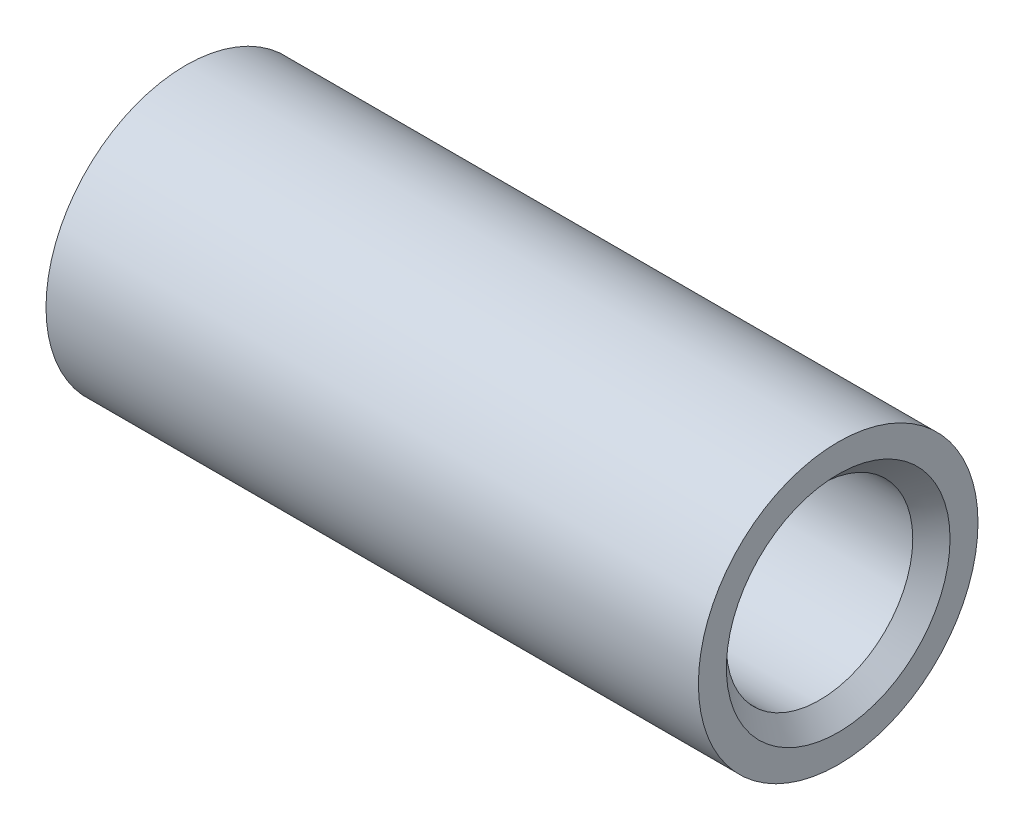
ISO-10303-21;
HEADER;
FILE_DESCRIPTION(('STEP AP214'),'2;1');
FILE_NAME('part.step','',(''),(''),'','','');
FILE_SCHEMA(('AUTOMOTIVE_DESIGN { 1 0 10303 214 1 1 1 1 }'));
ENDSEC;
DATA;
#1=APPLICATION_CONTEXT('core data for automotive mechanical design processes');
#2=APPLICATION_PROTOCOL_DEFINITION('international standard','automotive_design',2000,#1);
#3=PRODUCT_CONTEXT('',#1,'mechanical');
#4=PRODUCT('Part','Part','',(#3));
#5=PRODUCT_RELATED_PRODUCT_CATEGORY('part','',(#4));
#6=PRODUCT_DEFINITION_FORMATION('','',#4);
#7=PRODUCT_DEFINITION_CONTEXT('part definition',#1,'design');
#8=PRODUCT_DEFINITION('design','',#6,#7);
#9=PRODUCT_DEFINITION_SHAPE('','',#8);
#10=(LENGTH_UNIT() NAMED_UNIT(*) SI_UNIT(.MILLI.,.METRE.));
#11=(NAMED_UNIT(*) PLANE_ANGLE_UNIT() SI_UNIT($,.RADIAN.));
#12=(NAMED_UNIT(*) SI_UNIT($,.STERADIAN.) SOLID_ANGLE_UNIT());
#13=UNCERTAINTY_MEASURE_WITH_UNIT(LENGTH_MEASURE(1.E-05),#10,'distance_accuracy_value','');
#14=(GEOMETRIC_REPRESENTATION_CONTEXT(3) GLOBAL_UNCERTAINTY_ASSIGNED_CONTEXT((#13)) GLOBAL_UNIT_ASSIGNED_CONTEXT((#10,
#11,#12)) REPRESENTATION_CONTEXT('',''));
#15=CARTESIAN_POINT('',(0.,0.,0.));
#16=DIRECTION('',(0.,0.,1.));
#17=DIRECTION('',(1.,0.,0.));
#18=AXIS2_PLACEMENT_3D('',#15,#16,#17);
#19=CARTESIAN_POINT('',(602.,602.499999999999,514.79019945775));
#20=DIRECTION('',(1.,0.,0.));
#21=DIRECTION('',(0.,0.,-1.));
#22=AXIS2_PLACEMENT_3D('',#19,#20,#21);
#23=CYLINDRICAL_SURFACE('',#22,15.0000000000002);
#24=CARTESIAN_POINT('',(602.,602.499999999999,514.79019945775));
#25=DIRECTION('',(1.,0.,0.));
#26=DIRECTION('',(0.,0.,-1.));
#27=AXIS2_PLACEMENT_3D('',#24,#25,#26);
#28=CIRCLE('',#27,15.0000000000002);
#29=CARTESIAN_POINT('',(602.,602.499999999999,499.79019945775));
#30=VERTEX_POINT('',#29);
#31=EDGE_CURVE('E47',#30,#30,#28,.T.);
#32=ORIENTED_EDGE('',*,*,#31,.T.);
#33=EDGE_LOOP('',(#32));
#34=FACE_BOUND('',#33,.T.);
#35=CARTESIAN_POINT('',(672.,602.499999999999,514.79019945775));
#36=DIRECTION('',(1.,0.,0.));
#37=DIRECTION('',(0.,0.,-1.));
#38=AXIS2_PLACEMENT_3D('',#35,#36,#37);
#39=CIRCLE('',#38,15.0000000000002);
#40=CARTESIAN_POINT('',(672.,602.499999999999,499.790199457749));
#41=VERTEX_POINT('',#40);
#42=EDGE_CURVE('E51',#41,#41,#39,.T.);
#43=ORIENTED_EDGE('',*,*,#42,.F.);
#44=EDGE_LOOP('',(#43));
#45=FACE_BOUND('',#44,.T.);
#46=ADVANCED_FACE('F35',(#34,#45),#23,.T.);
#47=CARTESIAN_POINT('',(602.,602.499999999999,514.79019945775));
#48=DIRECTION('',(1.,0.,0.));
#49=DIRECTION('',(0.,0.,-1.));
#50=AXIS2_PLACEMENT_3D('',#47,#48,#49);
#51=PLANE('',#50);
#52=CARTESIAN_POINT('',(602.,602.499999999999,514.79019945775));
#53=DIRECTION('',(1.,0.,0.));
#54=DIRECTION('',(0.,0.,-1.));
#55=AXIS2_PLACEMENT_3D('',#52,#53,#54);
#56=CIRCLE('',#55,10.0000000000001);
#57=CARTESIAN_POINT('',(602.,602.499999999999,504.79019945775));
#58=VERTEX_POINT('',#57);
#59=EDGE_CURVE('E55',#58,#58,#56,.T.);
#60=ORIENTED_EDGE('',*,*,#59,.T.);
#61=EDGE_LOOP('',(#60));
#62=FACE_BOUND('',#61,.T.);
#63=ORIENTED_EDGE('',*,*,#31,.F.);
#64=EDGE_LOOP('',(#63));
#65=FACE_BOUND('',#64,.T.);
#66=ADVANCED_FACE('F60',(#62,#65),#51,.F.);
#67=CARTESIAN_POINT('',(672.,602.499999999999,514.79019945775));
#68=DIRECTION('',(1.,0.,0.));
#69=DIRECTION('',(0.,0.,-1.));
#70=AXIS2_PLACEMENT_3D('',#67,#68,#69);
#71=PLANE('',#70);
#72=CARTESIAN_POINT('',(672.,602.499999999999,514.79019945775));
#73=DIRECTION('',(1.,0.,0.));
#74=DIRECTION('',(0.,0.,-1.));
#75=AXIS2_PLACEMENT_3D('',#72,#73,#74);
#76=CIRCLE('',#75,12.0000000000008);
#77=CARTESIAN_POINT('',(672.,602.499999999999,502.790199457749));
#78=VERTEX_POINT('',#77);
#79=EDGE_CURVE('E10',#78,#78,#76,.F.);
#80=ORIENTED_EDGE('',*,*,#79,.T.);
#81=EDGE_LOOP('',(#80));
#82=FACE_BOUND('',#81,.T.);
#83=ORIENTED_EDGE('',*,*,#42,.T.);
#84=EDGE_LOOP('',(#83));
#85=FACE_BOUND('',#84,.T.);
#86=ADVANCED_FACE('F65',(#82,#85),#71,.T.);
#87=CARTESIAN_POINT('',(602.,602.499999999999,514.79019945775));
#88=DIRECTION('',(1.,0.,0.));
#89=DIRECTION('',(0.,0.,-1.));
#90=AXIS2_PLACEMENT_3D('',#87,#88,#89);
#91=CYLINDRICAL_SURFACE('',#90,10.0000000000001);
#92=CARTESIAN_POINT('',(670.,602.499999999999,514.79019945775));
#93=DIRECTION('',(1.,0.,0.));
#94=DIRECTION('',(0.,0.,-1.));
#95=AXIS2_PLACEMENT_3D('',#92,#93,#94);
#96=CIRCLE('',#95,10.0000000000001);
#97=CARTESIAN_POINT('',(669.999999999999,602.499999999999,504.79019945775));
#98=VERTEX_POINT('',#97);
#99=EDGE_CURVE('E43',#98,#98,#96,.T.);
#100=ORIENTED_EDGE('',*,*,#99,.T.);
#101=EDGE_LOOP('',(#100));
#102=FACE_BOUND('',#101,.T.);
#103=ORIENTED_EDGE('',*,*,#59,.F.);
#104=EDGE_LOOP('',(#103));
#105=FACE_BOUND('',#104,.T.);
#106=ADVANCED_FACE('F63',(#102,#105),#91,.F.);
#107=CARTESIAN_POINT('',(670.,602.499999999999,514.79019945775));
#108=DIRECTION('',(1.,0.,0.));
#109=DIRECTION('',(0.,0.,-1.));
#110=AXIS2_PLACEMENT_3D('',#107,#108,#109);
#111=CONICAL_SURFACE('',#110,10.0000000000001,0.785398163397439);
#112=ORIENTED_EDGE('',*,*,#79,.F.);
#113=EDGE_LOOP('',(#112));
#114=FACE_BOUND('',#113,.T.);
#115=ORIENTED_EDGE('',*,*,#99,.F.);
#116=EDGE_LOOP('',(#115));
#117=FACE_BOUND('',#116,.T.);
#118=ADVANCED_FACE('F38',(#114,#117),#111,.F.);
#119=CLOSED_SHELL('',(#46,#66,#86,#106,#118));
#120=MANIFOLD_SOLID_BREP('B2',#119);
#121=ADVANCED_BREP_SHAPE_REPRESENTATION('',(#18,#120),#14);
#122=SHAPE_DEFINITION_REPRESENTATION(#9,#121);
ENDSEC;
END-ISO-10303-21;
